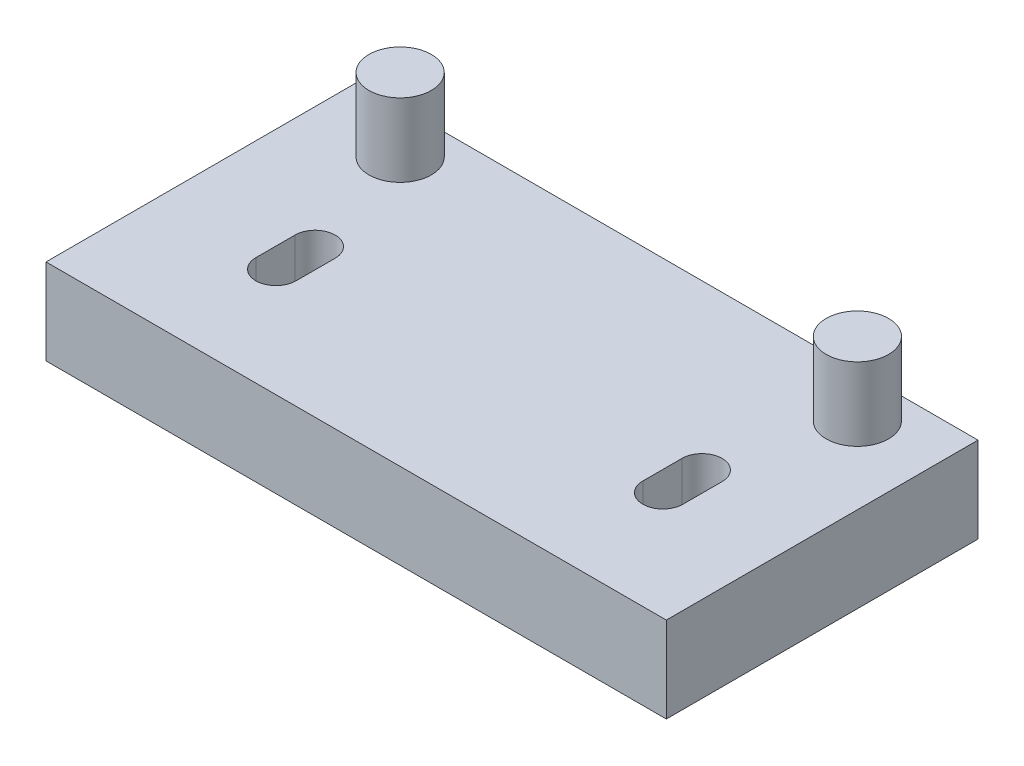
ISO-10303-21;
HEADER;
FILE_DESCRIPTION(('STEP AP214'),'2;1');
FILE_NAME('part.step','',(''),(''),'','','');
FILE_SCHEMA(('AUTOMOTIVE_DESIGN { 1 0 10303 214 1 1 1 1 }'));
ENDSEC;
DATA;
#1=APPLICATION_CONTEXT('core data for automotive mechanical design processes');
#2=APPLICATION_PROTOCOL_DEFINITION('international standard','automotive_design',2000,#1);
#3=PRODUCT_CONTEXT('',#1,'mechanical');
#4=PRODUCT('Part','Part','',(#3));
#5=PRODUCT_RELATED_PRODUCT_CATEGORY('part','',(#4));
#6=PRODUCT_DEFINITION_FORMATION('','',#4);
#7=PRODUCT_DEFINITION_CONTEXT('part definition',#1,'design');
#8=PRODUCT_DEFINITION('design','',#6,#7);
#9=PRODUCT_DEFINITION_SHAPE('','',#8);
#10=(LENGTH_UNIT() NAMED_UNIT(*) SI_UNIT(.MILLI.,.METRE.));
#11=(NAMED_UNIT(*) PLANE_ANGLE_UNIT() SI_UNIT($,.RADIAN.));
#12=(NAMED_UNIT(*) SI_UNIT($,.STERADIAN.) SOLID_ANGLE_UNIT());
#13=UNCERTAINTY_MEASURE_WITH_UNIT(LENGTH_MEASURE(1.E-05),#10,'distance_accuracy_value','');
#14=(GEOMETRIC_REPRESENTATION_CONTEXT(3) GLOBAL_UNCERTAINTY_ASSIGNED_CONTEXT((#13)) GLOBAL_UNIT_ASSIGNED_CONTEXT((#10,
#11,#12)) REPRESENTATION_CONTEXT('',''));
#15=CARTESIAN_POINT('',(0.,0.,0.));
#16=DIRECTION('',(0.,0.,1.));
#17=DIRECTION('',(1.,0.,0.));
#18=AXIS2_PLACEMENT_3D('',#15,#16,#17);
#19=CARTESIAN_POINT('',(0.,41.656,0.));
#20=DIRECTION('',(0.,1.,0.));
#21=DIRECTION('',(0.,0.,1.));
#22=AXIS2_PLACEMENT_3D('',#19,#20,#21);
#23=PLANE('',#22);
#24=CARTESIAN_POINT('',(111.073870724879,41.656,-54.4875566383733));
#25=DIRECTION('',(0.,1.,0.));
#26=DIRECTION('',(0.,0.,1.));
#27=AXIS2_PLACEMENT_3D('',#24,#25,#26);
#28=CIRCLE('',#27,15.1611107918077);
#29=CARTESIAN_POINT('',(111.073870724879,41.656,-39.3264458465656));
#30=VERTEX_POINT('',#29);
#31=EDGE_CURVE('E11',#30,#30,#28,.T.);
#32=ORIENTED_EDGE('',*,*,#31,.F.);
#33=EDGE_LOOP('',(#32));
#34=FACE_BOUND('',#33,.T.);
#35=CARTESIAN_POINT('',(-111.073870724879,41.656,-54.4875566383733));
#36=DIRECTION('',(0.,1.,0.));
#37=DIRECTION('',(0.,0.,1.));
#38=AXIS2_PLACEMENT_3D('',#35,#36,#37);
#39=CIRCLE('',#38,15.1611107918077);
#40=CARTESIAN_POINT('',(-111.073870724879,41.656,-39.3264458465656));
#41=VERTEX_POINT('',#40);
#42=EDGE_CURVE('E152',#41,#41,#39,.T.);
#43=ORIENTED_EDGE('',*,*,#42,.F.);
#44=EDGE_LOOP('',(#43));
#45=FACE_BOUND('',#44,.T.);
#46=CARTESIAN_POINT('',(-93.9920008541469,41.656,3.9044273990243));
#47=DIRECTION('',(0.,1.,0.));
#48=DIRECTION('',(0.,0.,1.));
#49=AXIS2_PLACEMENT_3D('',#46,#47,#48);
#50=CIRCLE('',#49,9.76106849756106);
#51=CARTESIAN_POINT('',(-84.2309323565858,41.656,3.9044273990243));
#52=VERTEX_POINT('',#51);
#53=CARTESIAN_POINT('',(-103.753069351708,41.656,3.9044273990243));
#54=VERTEX_POINT('',#53);
#55=EDGE_CURVE('E151',#52,#54,#50,.T.);
#56=ORIENTED_EDGE('',*,*,#55,.F.);
#57=DIRECTION('',(0.,0.,-1.));
#58=VECTOR('',#57,1.);
#59=CARTESIAN_POINT('',(-84.2309323565858,41.656,22.9385109692684));
#60=LINE('',#59,#58);
#61=CARTESIAN_POINT('',(-84.2309323565858,41.656,22.9385109692684));
#62=VERTEX_POINT('',#61);
#63=EDGE_CURVE('E164',#62,#52,#60,.T.);
#64=ORIENTED_EDGE('',*,*,#63,.F.);
#65=CARTESIAN_POINT('',(-93.9920008541469,41.656,22.9385109692684));
#66=DIRECTION('',(0.,1.,0.));
#67=DIRECTION('',(0.,0.,1.));
#68=AXIS2_PLACEMENT_3D('',#65,#66,#67);
#69=CIRCLE('',#68,9.76106849756106);
#70=CARTESIAN_POINT('',(-103.753069351708,41.656,22.9385109692684));
#71=VERTEX_POINT('',#70);
#72=EDGE_CURVE('E161',#71,#62,#69,.T.);
#73=ORIENTED_EDGE('',*,*,#72,.F.);
#74=DIRECTION('',(0.,0.,1.));
#75=VECTOR('',#74,1.);
#76=CARTESIAN_POINT('',(-103.753069351708,41.656,3.9044273990243));
#77=LINE('',#76,#75);
#78=EDGE_CURVE('E158',#54,#71,#77,.T.);
#79=ORIENTED_EDGE('',*,*,#78,.F.);
#80=EDGE_LOOP('',(#56,#64,#73,#79));
#81=FACE_BOUND('',#80,.T.);
#82=DIRECTION('',(0.,0.,-1.));
#83=VECTOR('',#82,1.);
#84=CARTESIAN_POINT('',(148.451146145828,41.656,-75.7175443909627));
#85=LINE('',#84,#83);
#86=CARTESIAN_POINT('',(148.451146145828,41.656,75.7175443909627));
#87=VERTEX_POINT('',#86);
#88=CARTESIAN_POINT('',(148.451146145828,41.656,-75.7175443909627));
#89=VERTEX_POINT('',#88);
#90=EDGE_CURVE('E177',#87,#89,#85,.T.);
#91=ORIENTED_EDGE('',*,*,#90,.T.);
#92=DIRECTION('',(-1.,0.,0.));
#93=VECTOR('',#92,1.);
#94=CARTESIAN_POINT('',(-152.927060099974,41.656,-75.7175443909627));
#95=LINE('',#94,#93);
#96=CARTESIAN_POINT('',(-152.927060099974,41.656,-75.7175443909627));
#97=VERTEX_POINT('',#96);
#98=EDGE_CURVE('E180',#89,#97,#95,.T.);
#99=ORIENTED_EDGE('',*,*,#98,.T.);
#100=DIRECTION('',(0.,0.,1.));
#101=VECTOR('',#100,1.);
#102=CARTESIAN_POINT('',(-152.927060099974,41.656,-75.7175443909627));
#103=LINE('',#102,#101);
#104=CARTESIAN_POINT('',(-152.927060099974,41.656,75.7175443909627));
#105=VERTEX_POINT('',#104);
#106=EDGE_CURVE('E183',#97,#105,#103,.T.);
#107=ORIENTED_EDGE('',*,*,#106,.T.);
#108=DIRECTION('',(1.,0.,0.));
#109=VECTOR('',#108,1.);
#110=CARTESIAN_POINT('',(-152.927060099974,41.656,75.7175443909627));
#111=LINE('',#110,#109);
#112=EDGE_CURVE('E185',#105,#87,#111,.T.);
#113=ORIENTED_EDGE('',*,*,#112,.T.);
#114=EDGE_LOOP('',(#91,#99,#107,#113));
#115=FACE_BOUND('',#114,.T.);
#116=DIRECTION('',(0.,0.,-1.));
#117=VECTOR('',#116,1.);
#118=CARTESIAN_POINT('',(84.2309323565858,41.656,22.9385109692684));
#119=LINE('',#118,#117);
#120=CARTESIAN_POINT('',(84.2309323565858,41.656,22.9385109692684));
#121=VERTEX_POINT('',#120);
#122=CARTESIAN_POINT('',(84.2309323565858,41.656,3.9044273990243));
#123=VERTEX_POINT('',#122);
#124=EDGE_CURVE('E134',#121,#123,#119,.T.);
#125=ORIENTED_EDGE('',*,*,#124,.T.);
#126=CARTESIAN_POINT('',(93.9920008541469,41.656,3.9044273990243));
#127=DIRECTION('',(0.,-1.,0.));
#128=DIRECTION('',(0.,0.,1.));
#129=AXIS2_PLACEMENT_3D('',#126,#127,#128);
#130=CIRCLE('',#129,9.76106849756106);
#131=CARTESIAN_POINT('',(103.753069351708,41.656,3.9044273990243));
#132=VERTEX_POINT('',#131);
#133=EDGE_CURVE('E48',#123,#132,#130,.T.);
#134=ORIENTED_EDGE('',*,*,#133,.T.);
#135=DIRECTION('',(0.,0.,1.));
#136=VECTOR('',#135,1.);
#137=CARTESIAN_POINT('',(103.753069351708,41.656,3.9044273990243));
#138=LINE('',#137,#136);
#139=CARTESIAN_POINT('',(103.753069351708,41.656,22.9385109692684));
#140=VERTEX_POINT('',#139);
#141=EDGE_CURVE('E139',#132,#140,#138,.T.);
#142=ORIENTED_EDGE('',*,*,#141,.T.);
#143=CARTESIAN_POINT('',(93.9920008541469,41.656,22.9385109692684));
#144=DIRECTION('',(0.,-1.,0.));
#145=DIRECTION('',(0.,0.,1.));
#146=AXIS2_PLACEMENT_3D('',#143,#144,#145);
#147=CIRCLE('',#146,9.76106849756106);
#148=EDGE_CURVE('E125',#140,#121,#147,.T.);
#149=ORIENTED_EDGE('',*,*,#148,.T.);
#150=EDGE_LOOP('',(#125,#134,#142,#149));
#151=FACE_BOUND('',#150,.T.);
#152=ADVANCED_FACE('F33',(#34,#45,#81,#115,#151),#23,.T.);
#153=CARTESIAN_POINT('',(0.,0.,0.));
#154=DIRECTION('',(0.,1.,0.));
#155=DIRECTION('',(0.,0.,1.));
#156=AXIS2_PLACEMENT_3D('',#153,#154,#155);
#157=PLANE('',#156);
#158=DIRECTION('',(0.,0.,-1.));
#159=VECTOR('',#158,1.);
#160=CARTESIAN_POINT('',(148.451146145828,0.,-75.7175443909627));
#161=LINE('',#160,#159);
#162=CARTESIAN_POINT('',(148.451146145828,0.,75.7175443909627));
#163=VERTEX_POINT('',#162);
#164=CARTESIAN_POINT('',(148.451146145828,0.,-75.7175443909627));
#165=VERTEX_POINT('',#164);
#166=EDGE_CURVE('E170',#163,#165,#161,.T.);
#167=ORIENTED_EDGE('',*,*,#166,.F.);
#168=DIRECTION('',(1.,0.,0.));
#169=VECTOR('',#168,1.);
#170=CARTESIAN_POINT('',(-152.927060099974,0.,75.7175443909627));
#171=LINE('',#170,#169);
#172=CARTESIAN_POINT('',(-152.927060099974,0.,75.7175443909627));
#173=VERTEX_POINT('',#172);
#174=EDGE_CURVE('E181',#173,#163,#171,.T.);
#175=ORIENTED_EDGE('',*,*,#174,.F.);
#176=DIRECTION('',(0.,0.,1.));
#177=VECTOR('',#176,1.);
#178=CARTESIAN_POINT('',(-152.927060099974,0.,-75.7175443909627));
#179=LINE('',#178,#177);
#180=CARTESIAN_POINT('',(-152.927060099974,0.,-75.7175443909627));
#181=VERTEX_POINT('',#180);
#182=EDGE_CURVE('E192',#181,#173,#179,.T.);
#183=ORIENTED_EDGE('',*,*,#182,.F.);
#184=DIRECTION('',(-1.,0.,0.));
#185=VECTOR('',#184,1.);
#186=CARTESIAN_POINT('',(-152.927060099974,0.,-75.7175443909627));
#187=LINE('',#186,#185);
#188=EDGE_CURVE('E190',#165,#181,#187,.T.);
#189=ORIENTED_EDGE('',*,*,#188,.F.);
#190=EDGE_LOOP('',(#167,#175,#183,#189));
#191=FACE_BOUND('',#190,.T.);
#192=DIRECTION('',(0.,0.,-1.));
#193=VECTOR('',#192,1.);
#194=CARTESIAN_POINT('',(-84.2309323565858,0.,0.));
#195=LINE('',#194,#193);
#196=CARTESIAN_POINT('',(-84.2309323565858,0.,22.9385109692684));
#197=VERTEX_POINT('',#196);
#198=CARTESIAN_POINT('',(-84.2309323565858,0.,3.9044273990243));
#199=VERTEX_POINT('',#198);
#200=EDGE_CURVE('E212',#197,#199,#195,.T.);
#201=ORIENTED_EDGE('',*,*,#200,.T.);
#202=CARTESIAN_POINT('',(-93.9920008541469,0.,3.9044273990243));
#203=DIRECTION('',(0.,1.,0.));
#204=DIRECTION('',(0.,0.,1.));
#205=AXIS2_PLACEMENT_3D('',#202,#203,#204);
#206=CIRCLE('',#205,9.76106849756106);
#207=CARTESIAN_POINT('',(-103.753069351708,0.,3.9044273990243));
#208=VERTEX_POINT('',#207);
#209=EDGE_CURVE('E156',#199,#208,#206,.T.);
#210=ORIENTED_EDGE('',*,*,#209,.T.);
#211=DIRECTION('',(0.,0.,1.));
#212=VECTOR('',#211,1.);
#213=CARTESIAN_POINT('',(-103.753069351708,0.,0.));
#214=LINE('',#213,#212);
#215=CARTESIAN_POINT('',(-103.753069351708,0.,22.9385109692684));
#216=VERTEX_POINT('',#215);
#217=EDGE_CURVE('E206',#208,#216,#214,.T.);
#218=ORIENTED_EDGE('',*,*,#217,.T.);
#219=CARTESIAN_POINT('',(-93.9920008541469,0.,22.9385109692684));
#220=DIRECTION('',(0.,1.,0.));
#221=DIRECTION('',(0.,0.,1.));
#222=AXIS2_PLACEMENT_3D('',#219,#220,#221);
#223=CIRCLE('',#222,9.76106849756106);
#224=EDGE_CURVE('E209',#216,#197,#223,.T.);
#225=ORIENTED_EDGE('',*,*,#224,.T.);
#226=EDGE_LOOP('',(#201,#210,#218,#225));
#227=FACE_BOUND('',#226,.T.);
#228=CARTESIAN_POINT('',(93.9920008541469,0.,3.9044273990243));
#229=DIRECTION('',(0.,1.,0.));
#230=DIRECTION('',(0.,0.,1.));
#231=AXIS2_PLACEMENT_3D('',#228,#229,#230);
#232=CIRCLE('',#231,9.76106849756106);
#233=CARTESIAN_POINT('',(84.2309323565858,0.,3.9044273990243));
#234=VERTEX_POINT('',#233);
#235=CARTESIAN_POINT('',(103.753069351708,0.,3.9044273990243));
#236=VERTEX_POINT('',#235);
#237=EDGE_CURVE('E41',#234,#236,#232,.F.);
#238=ORIENTED_EDGE('',*,*,#237,.F.);
#239=DIRECTION('',(0.,0.,-1.));
#240=VECTOR('',#239,1.);
#241=CARTESIAN_POINT('',(84.2309323565858,0.,0.));
#242=LINE('',#241,#240);
#243=CARTESIAN_POINT('',(84.2309323565858,0.,22.9385109692684));
#244=VERTEX_POINT('',#243);
#245=EDGE_CURVE('E155',#244,#234,#242,.T.);
#246=ORIENTED_EDGE('',*,*,#245,.F.);
#247=CARTESIAN_POINT('',(93.9920008541469,0.,22.9385109692684));
#248=DIRECTION('',(0.,1.,0.));
#249=DIRECTION('',(0.,0.,1.));
#250=AXIS2_PLACEMENT_3D('',#247,#248,#249);
#251=CIRCLE('',#250,9.76106849756106);
#252=CARTESIAN_POINT('',(103.753069351708,0.,22.9385109692684));
#253=VERTEX_POINT('',#252);
#254=EDGE_CURVE('E128',#253,#244,#251,.F.);
#255=ORIENTED_EDGE('',*,*,#254,.F.);
#256=DIRECTION('',(0.,0.,1.));
#257=VECTOR('',#256,1.);
#258=CARTESIAN_POINT('',(103.753069351708,0.,0.));
#259=LINE('',#258,#257);
#260=EDGE_CURVE('E219',#236,#253,#259,.T.);
#261=ORIENTED_EDGE('',*,*,#260,.F.);
#262=EDGE_LOOP('',(#238,#246,#255,#261));
#263=FACE_BOUND('',#262,.T.);
#264=ADVANCED_FACE('F227',(#191,#227,#263),#157,.F.);
#265=CARTESIAN_POINT('',(148.451146145828,41.656,-75.7175443909627));
#266=DIRECTION('',(-1.,0.,0.));
#267=DIRECTION('',(0.,0.,1.));
#268=AXIS2_PLACEMENT_3D('',#265,#266,#267);
#269=PLANE('',#268);
#270=ORIENTED_EDGE('',*,*,#166,.T.);
#271=DIRECTION('',(0.,-1.,0.));
#272=VECTOR('',#271,1.);
#273=CARTESIAN_POINT('',(148.451146145828,41.656,-75.7175443909627));
#274=LINE('',#273,#272);
#275=EDGE_CURVE('E203',#89,#165,#274,.T.);
#276=ORIENTED_EDGE('',*,*,#275,.F.);
#277=ORIENTED_EDGE('',*,*,#90,.F.);
#278=DIRECTION('',(0.,-1.,0.));
#279=VECTOR('',#278,1.);
#280=CARTESIAN_POINT('',(148.451146145828,41.656,75.7175443909627));
#281=LINE('',#280,#279);
#282=EDGE_CURVE('E187',#87,#163,#281,.T.);
#283=ORIENTED_EDGE('',*,*,#282,.T.);
#284=EDGE_LOOP('',(#270,#276,#277,#283));
#285=FACE_BOUND('',#284,.T.);
#286=ADVANCED_FACE('F35',(#285),#269,.F.);
#287=CARTESIAN_POINT('',(-152.927060099974,41.656,-75.7175443909627));
#288=DIRECTION('',(0.,0.,1.));
#289=DIRECTION('',(1.,0.,0.));
#290=AXIS2_PLACEMENT_3D('',#287,#288,#289);
#291=PLANE('',#290);
#292=ORIENTED_EDGE('',*,*,#188,.T.);
#293=DIRECTION('',(0.,-1.,0.));
#294=VECTOR('',#293,1.);
#295=CARTESIAN_POINT('',(-152.927060099974,41.656,-75.7175443909627));
#296=LINE('',#295,#294);
#297=EDGE_CURVE('E200',#97,#181,#296,.T.);
#298=ORIENTED_EDGE('',*,*,#297,.F.);
#299=ORIENTED_EDGE('',*,*,#98,.F.);
#300=ORIENTED_EDGE('',*,*,#275,.T.);
#301=EDGE_LOOP('',(#292,#298,#299,#300));
#302=FACE_BOUND('',#301,.T.);
#303=ADVANCED_FACE('F235',(#302),#291,.F.);
#304=CARTESIAN_POINT('',(-152.927060099974,41.656,-75.7175443909627));
#305=DIRECTION('',(1.,0.,0.));
#306=DIRECTION('',(0.,0.,-1.));
#307=AXIS2_PLACEMENT_3D('',#304,#305,#306);
#308=PLANE('',#307);
#309=ORIENTED_EDGE('',*,*,#182,.T.);
#310=DIRECTION('',(0.,-1.,0.));
#311=VECTOR('',#310,1.);
#312=CARTESIAN_POINT('',(-152.927060099974,41.656,75.7175443909627));
#313=LINE('',#312,#311);
#314=EDGE_CURVE('E197',#105,#173,#313,.T.);
#315=ORIENTED_EDGE('',*,*,#314,.F.);
#316=ORIENTED_EDGE('',*,*,#106,.F.);
#317=ORIENTED_EDGE('',*,*,#297,.T.);
#318=EDGE_LOOP('',(#309,#315,#316,#317));
#319=FACE_BOUND('',#318,.T.);
#320=ADVANCED_FACE('F247',(#319),#308,.F.);
#321=CARTESIAN_POINT('',(-152.927060099974,41.656,75.7175443909627));
#322=DIRECTION('',(0.,0.,-1.));
#323=DIRECTION('',(-1.,0.,0.));
#324=AXIS2_PLACEMENT_3D('',#321,#322,#323);
#325=PLANE('',#324);
#326=ORIENTED_EDGE('',*,*,#174,.T.);
#327=ORIENTED_EDGE('',*,*,#282,.F.);
#328=ORIENTED_EDGE('',*,*,#112,.F.);
#329=ORIENTED_EDGE('',*,*,#314,.T.);
#330=EDGE_LOOP('',(#326,#327,#328,#329));
#331=FACE_BOUND('',#330,.T.);
#332=ADVANCED_FACE('F243',(#331),#325,.F.);
#333=CARTESIAN_POINT('',(-93.9920008541469,-172.72,3.9044273990243));
#334=DIRECTION('',(0.,1.,0.));
#335=DIRECTION('',(0.,0.,1.));
#336=AXIS2_PLACEMENT_3D('',#333,#334,#335);
#337=CYLINDRICAL_SURFACE('',#336,9.76106849756106);
#338=DIRECTION('',(0.,1.,0.));
#339=VECTOR('',#338,1.);
#340=CARTESIAN_POINT('',(-84.2309323565858,-172.72,3.9044273990243));
#341=LINE('',#340,#339);
#342=EDGE_CURVE('E168',#199,#52,#341,.T.);
#343=ORIENTED_EDGE('',*,*,#342,.T.);
#344=ORIENTED_EDGE('',*,*,#55,.T.);
#345=DIRECTION('',(0.,1.,0.));
#346=VECTOR('',#345,1.);
#347=CARTESIAN_POINT('',(-103.753069351708,-172.72,3.9044273990243));
#348=LINE('',#347,#346);
#349=EDGE_CURVE('E167',#208,#54,#348,.T.);
#350=ORIENTED_EDGE('',*,*,#349,.F.);
#351=ORIENTED_EDGE('',*,*,#209,.F.);
#352=EDGE_LOOP('',(#343,#344,#350,#351));
#353=FACE_BOUND('',#352,.T.);
#354=ADVANCED_FACE('F246',(#353),#337,.F.);
#355=CARTESIAN_POINT('',(-84.2309323565858,-172.72,22.9385109692684));
#356=DIRECTION('',(1.,0.,0.));
#357=DIRECTION('',(0.,0.,-1.));
#358=AXIS2_PLACEMENT_3D('',#355,#356,#357);
#359=PLANE('',#358);
#360=DIRECTION('',(0.,1.,0.));
#361=VECTOR('',#360,1.);
#362=CARTESIAN_POINT('',(-84.2309323565858,-172.72,22.9385109692684));
#363=LINE('',#362,#361);
#364=EDGE_CURVE('E171',#197,#62,#363,.T.);
#365=ORIENTED_EDGE('',*,*,#364,.T.);
#366=ORIENTED_EDGE('',*,*,#63,.T.);
#367=ORIENTED_EDGE('',*,*,#342,.F.);
#368=ORIENTED_EDGE('',*,*,#200,.F.);
#369=EDGE_LOOP('',(#365,#366,#367,#368));
#370=FACE_BOUND('',#369,.T.);
#371=ADVANCED_FACE('F281',(#370),#359,.F.);
#372=CARTESIAN_POINT('',(-93.9920008541469,-172.72,22.9385109692684));
#373=DIRECTION('',(0.,1.,0.));
#374=DIRECTION('',(0.,0.,1.));
#375=AXIS2_PLACEMENT_3D('',#372,#373,#374);
#376=CYLINDRICAL_SURFACE('',#375,9.76106849756106);
#377=DIRECTION('',(0.,1.,0.));
#378=VECTOR('',#377,1.);
#379=CARTESIAN_POINT('',(-103.753069351708,-172.72,22.9385109692684));
#380=LINE('',#379,#378);
#381=EDGE_CURVE('E173',#216,#71,#380,.T.);
#382=ORIENTED_EDGE('',*,*,#381,.T.);
#383=ORIENTED_EDGE('',*,*,#72,.T.);
#384=ORIENTED_EDGE('',*,*,#364,.F.);
#385=ORIENTED_EDGE('',*,*,#224,.F.);
#386=EDGE_LOOP('',(#382,#383,#384,#385));
#387=FACE_BOUND('',#386,.T.);
#388=ADVANCED_FACE('F288',(#387),#376,.F.);
#389=CARTESIAN_POINT('',(-103.753069351708,-172.72,3.9044273990243));
#390=DIRECTION('',(-1.,0.,0.));
#391=DIRECTION('',(0.,0.,1.));
#392=AXIS2_PLACEMENT_3D('',#389,#390,#391);
#393=PLANE('',#392);
#394=ORIENTED_EDGE('',*,*,#349,.T.);
#395=ORIENTED_EDGE('',*,*,#78,.T.);
#396=ORIENTED_EDGE('',*,*,#381,.F.);
#397=ORIENTED_EDGE('',*,*,#217,.F.);
#398=EDGE_LOOP('',(#394,#395,#396,#397));
#399=FACE_BOUND('',#398,.T.);
#400=ADVANCED_FACE('F296',(#399),#393,.F.);
#401=CARTESIAN_POINT('',(-111.073870724879,77.2160000000001,-54.4875566383733));
#402=DIRECTION('',(0.,-1.,0.));
#403=DIRECTION('',(0.,0.,-1.));
#404=AXIS2_PLACEMENT_3D('',#401,#402,#403);
#405=CYLINDRICAL_SURFACE('',#404,15.1611107918077);
#406=CARTESIAN_POINT('',(-111.073870724879,77.2160000000001,-54.4875566383733));
#407=DIRECTION('',(0.,1.,0.));
#408=DIRECTION('',(0.,0.,1.));
#409=AXIS2_PLACEMENT_3D('',#406,#407,#408);
#410=CIRCLE('',#409,15.1611107918077);
#411=CARTESIAN_POINT('',(-111.073870724879,77.2160000000001,-39.3264458465656));
#412=VERTEX_POINT('',#411);
#413=EDGE_CURVE('E146',#412,#412,#410,.T.);
#414=ORIENTED_EDGE('',*,*,#413,.F.);
#415=EDGE_LOOP('',(#414));
#416=FACE_BOUND('',#415,.T.);
#417=ORIENTED_EDGE('',*,*,#42,.T.);
#418=EDGE_LOOP('',(#417));
#419=FACE_BOUND('',#418,.T.);
#420=ADVANCED_FACE('F304',(#416,#419),#405,.T.);
#421=CARTESIAN_POINT('',(-111.073870724879,77.2160000000001,-54.4875566383733));
#422=DIRECTION('',(0.,1.,0.));
#423=DIRECTION('',(0.,0.,1.));
#424=AXIS2_PLACEMENT_3D('',#421,#422,#423);
#425=PLANE('',#424);
#426=ORIENTED_EDGE('',*,*,#413,.T.);
#427=EDGE_LOOP('',(#426));
#428=FACE_BOUND('',#427,.T.);
#429=ADVANCED_FACE('F312',(#428),#425,.T.);
#430=CARTESIAN_POINT('',(93.9920008541469,-172.72,3.9044273990243));
#431=DIRECTION('',(0.,1.,0.));
#432=DIRECTION('',(0.,0.,1.));
#433=AXIS2_PLACEMENT_3D('',#430,#431,#432);
#434=CYLINDRICAL_SURFACE('',#433,9.76106849756106);
#435=ORIENTED_EDGE('',*,*,#237,.T.);
#436=DIRECTION('',(0.,1.,0.));
#437=VECTOR('',#436,1.);
#438=CARTESIAN_POINT('',(103.753069351708,-172.72,3.9044273990243));
#439=LINE('',#438,#437);
#440=EDGE_CURVE('E144',#236,#132,#439,.T.);
#441=ORIENTED_EDGE('',*,*,#440,.T.);
#442=ORIENTED_EDGE('',*,*,#133,.F.);
#443=DIRECTION('',(0.,1.,0.));
#444=VECTOR('',#443,1.);
#445=CARTESIAN_POINT('',(84.2309323565858,-172.72,3.9044273990243));
#446=LINE('',#445,#444);
#447=EDGE_CURVE('E131',#234,#123,#446,.T.);
#448=ORIENTED_EDGE('',*,*,#447,.F.);
#449=EDGE_LOOP('',(#435,#441,#442,#448));
#450=FACE_BOUND('',#449,.T.);
#451=ADVANCED_FACE('F222',(#450),#434,.F.);
#452=CARTESIAN_POINT('',(103.753069351708,-172.72,3.9044273990243));
#453=DIRECTION('',(-1.,0.,0.));
#454=DIRECTION('',(0.,0.,1.));
#455=AXIS2_PLACEMENT_3D('',#452,#453,#454);
#456=PLANE('',#455);
#457=ORIENTED_EDGE('',*,*,#260,.T.);
#458=DIRECTION('',(0.,1.,0.));
#459=VECTOR('',#458,1.);
#460=CARTESIAN_POINT('',(103.753069351708,-172.72,22.9385109692684));
#461=LINE('',#460,#459);
#462=EDGE_CURVE('E130',#253,#140,#461,.T.);
#463=ORIENTED_EDGE('',*,*,#462,.T.);
#464=ORIENTED_EDGE('',*,*,#141,.F.);
#465=ORIENTED_EDGE('',*,*,#440,.F.);
#466=EDGE_LOOP('',(#457,#463,#464,#465));
#467=FACE_BOUND('',#466,.T.);
#468=ADVANCED_FACE('F226',(#467),#456,.T.);
#469=CARTESIAN_POINT('',(93.9920008541469,-172.72,22.9385109692684));
#470=DIRECTION('',(0.,1.,0.));
#471=DIRECTION('',(0.,0.,1.));
#472=AXIS2_PLACEMENT_3D('',#469,#470,#471);
#473=CYLINDRICAL_SURFACE('',#472,9.76106849756106);
#474=ORIENTED_EDGE('',*,*,#254,.T.);
#475=DIRECTION('',(0.,1.,0.));
#476=VECTOR('',#475,1.);
#477=CARTESIAN_POINT('',(84.2309323565858,-172.72,22.9385109692684));
#478=LINE('',#477,#476);
#479=EDGE_CURVE('E56',#244,#121,#478,.T.);
#480=ORIENTED_EDGE('',*,*,#479,.T.);
#481=ORIENTED_EDGE('',*,*,#148,.F.);
#482=ORIENTED_EDGE('',*,*,#462,.F.);
#483=EDGE_LOOP('',(#474,#480,#481,#482));
#484=FACE_BOUND('',#483,.T.);
#485=ADVANCED_FACE('F122',(#484),#473,.F.);
#486=CARTESIAN_POINT('',(84.2309323565858,-172.72,22.9385109692684));
#487=DIRECTION('',(1.,0.,0.));
#488=DIRECTION('',(0.,0.,-1.));
#489=AXIS2_PLACEMENT_3D('',#486,#487,#488);
#490=PLANE('',#489);
#491=ORIENTED_EDGE('',*,*,#245,.T.);
#492=ORIENTED_EDGE('',*,*,#447,.T.);
#493=ORIENTED_EDGE('',*,*,#124,.F.);
#494=ORIENTED_EDGE('',*,*,#479,.F.);
#495=EDGE_LOOP('',(#491,#492,#493,#494));
#496=FACE_BOUND('',#495,.T.);
#497=ADVANCED_FACE('F135',(#496),#490,.T.);
#498=CARTESIAN_POINT('',(111.073870724879,77.2160000000001,-54.4875566383733));
#499=DIRECTION('',(0.,-1.,0.));
#500=DIRECTION('',(0.,0.,-1.));
#501=AXIS2_PLACEMENT_3D('',#498,#499,#500);
#502=CYLINDRICAL_SURFACE('',#501,15.1611107918077);
#503=CARTESIAN_POINT('',(111.073870724879,77.2160000000001,-54.4875566383733));
#504=DIRECTION('',(0.,-1.,0.));
#505=DIRECTION('',(0.,0.,1.));
#506=AXIS2_PLACEMENT_3D('',#503,#504,#505);
#507=CIRCLE('',#506,15.1611107918077);
#508=CARTESIAN_POINT('',(111.073870724879,77.2160000000001,-39.3264458465656));
#509=VERTEX_POINT('',#508);
#510=EDGE_CURVE('E409',#509,#509,#507,.T.);
#511=ORIENTED_EDGE('',*,*,#510,.T.);
#512=EDGE_LOOP('',(#511));
#513=FACE_BOUND('',#512,.T.);
#514=ORIENTED_EDGE('',*,*,#31,.T.);
#515=EDGE_LOOP('',(#514));
#516=FACE_BOUND('',#515,.T.);
#517=ADVANCED_FACE('F346',(#513,#516),#502,.T.);
#518=CARTESIAN_POINT('',(111.073870724879,77.2160000000001,-54.4875566383733));
#519=DIRECTION('',(0.,1.,0.));
#520=DIRECTION('',(0.,0.,1.));
#521=AXIS2_PLACEMENT_3D('',#518,#519,#520);
#522=PLANE('',#521);
#523=ORIENTED_EDGE('',*,*,#510,.F.);
#524=EDGE_LOOP('',(#523));
#525=FACE_BOUND('',#524,.T.);
#526=ADVANCED_FACE('F353',(#525),#522,.T.);
#527=CLOSED_SHELL('',(#152,#264,#286,#303,#320,#332,#354,#371,#388,#400,#420,#429,#451,#468,
#485,#497,#517,#526));
#528=MANIFOLD_SOLID_BREP('B2',#527);
#529=ADVANCED_BREP_SHAPE_REPRESENTATION('',(#18,#528),#14);
#530=SHAPE_DEFINITION_REPRESENTATION(#9,#529);
ENDSEC;
END-ISO-10303-21;
